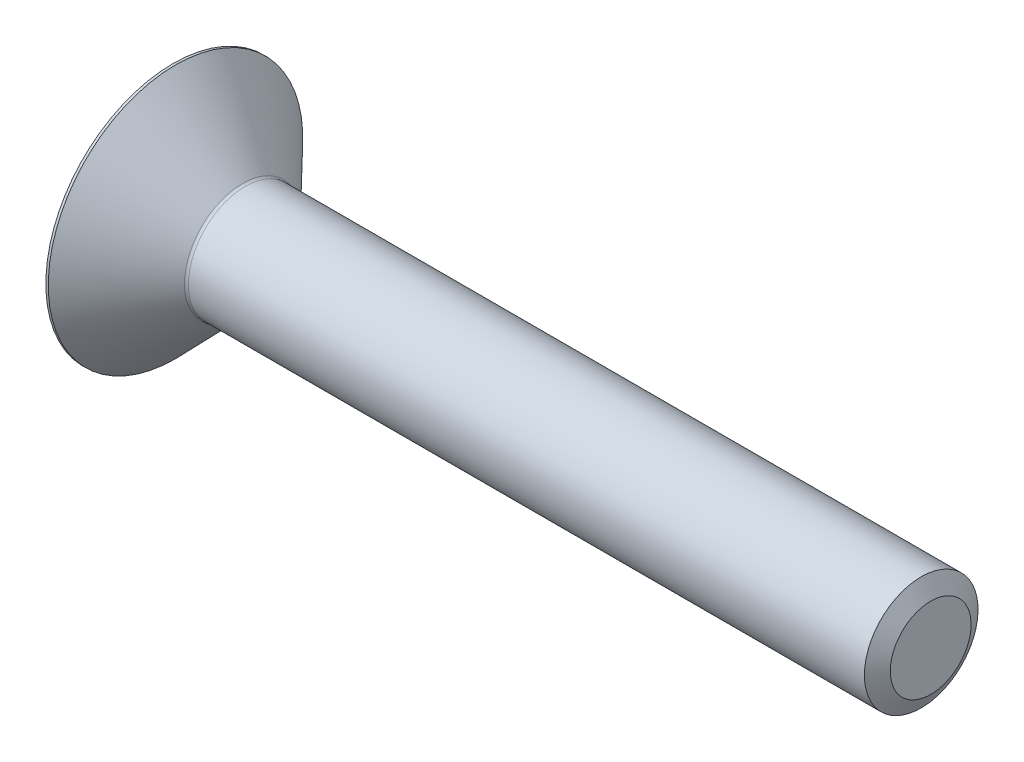
ISO-10303-21;
HEADER;
FILE_DESCRIPTION(('STEP AP214'),'2;1');
FILE_NAME('part.step','',(''),(''),'','','');
FILE_SCHEMA(('AUTOMOTIVE_DESIGN { 1 0 10303 214 1 1 1 1 }'));
ENDSEC;
DATA;
#1=APPLICATION_CONTEXT('core data for automotive mechanical design processes');
#2=APPLICATION_PROTOCOL_DEFINITION('international standard','automotive_design',2000,#1);
#3=PRODUCT_CONTEXT('',#1,'mechanical');
#4=PRODUCT('Part','Part','',(#3));
#5=PRODUCT_RELATED_PRODUCT_CATEGORY('part','',(#4));
#6=PRODUCT_DEFINITION_FORMATION('','',#4);
#7=PRODUCT_DEFINITION_CONTEXT('part definition',#1,'design');
#8=PRODUCT_DEFINITION('design','',#6,#7);
#9=PRODUCT_DEFINITION_SHAPE('','',#8);
#10=(LENGTH_UNIT() NAMED_UNIT(*) SI_UNIT(.MILLI.,.METRE.));
#11=(NAMED_UNIT(*) PLANE_ANGLE_UNIT() SI_UNIT($,.RADIAN.));
#12=(NAMED_UNIT(*) SI_UNIT($,.STERADIAN.) SOLID_ANGLE_UNIT());
#13=UNCERTAINTY_MEASURE_WITH_UNIT(LENGTH_MEASURE(1.E-05),#10,'distance_accuracy_value','');
#14=(GEOMETRIC_REPRESENTATION_CONTEXT(3) GLOBAL_UNCERTAINTY_ASSIGNED_CONTEXT((#13)) GLOBAL_UNIT_ASSIGNED_CONTEXT((#10,
#11,#12)) REPRESENTATION_CONTEXT('',''));
#15=CARTESIAN_POINT('',(0.,0.,0.));
#16=DIRECTION('',(0.,0.,1.));
#17=DIRECTION('',(1.,0.,0.));
#18=AXIS2_PLACEMENT_3D('',#15,#16,#17);
#19=CARTESIAN_POINT('',(0.,0.,0.));
#20=DIRECTION('',(1.,0.,0.));
#21=DIRECTION('',(0.,1.,0.));
#22=AXIS2_PLACEMENT_3D('',#19,#20,#21);
#23=CYLINDRICAL_SURFACE('',#22,1.5);
#24=CARTESIAN_POINT('',(-18.097552518379,0.,0.));
#25=DIRECTION('',(1.,0.,0.));
#26=DIRECTION('',(0.,1.,0.));
#27=AXIS2_PLACEMENT_3D('',#24,#25,#26);
#28=CIRCLE('',#27,1.5);
#29=CARTESIAN_POINT('',(-18.097552518379,1.5,0.));
#30=VERTEX_POINT('',#29);
#31=EDGE_CURVE('E133',#30,#30,#28,.T.);
#32=ORIENTED_EDGE('',*,*,#31,.T.);
#33=EDGE_LOOP('',(#32));
#34=FACE_BOUND('',#33,.T.);
#35=CARTESIAN_POINT('',(-0.25,0.,0.));
#36=DIRECTION('',(-1.,0.,0.));
#37=DIRECTION('',(0.,0.,1.));
#38=AXIS2_PLACEMENT_3D('',#35,#36,#37);
#39=CIRCLE('',#38,1.5);
#40=CARTESIAN_POINT('',(-0.25,0.,1.5));
#41=VERTEX_POINT('',#40);
#42=EDGE_CURVE('E321',#41,#41,#39,.T.);
#43=ORIENTED_EDGE('',*,*,#42,.T.);
#44=EDGE_LOOP('',(#43));
#45=FACE_BOUND('',#44,.T.);
#46=ADVANCED_FACE('F46',(#34,#45),#23,.T.);
#47=CARTESIAN_POINT('',(-20.,3.36,0.));
#48=DIRECTION('',(-1.,0.,0.));
#49=DIRECTION('',(0.,-1.,0.));
#50=AXIS2_PLACEMENT_3D('',#47,#48,#49);
#51=PLANE('',#50);
#52=CARTESIAN_POINT('',(-20.,0.,0.));
#53=DIRECTION('',(1.,0.,0.));
#54=DIRECTION('',(0.,1.,0.));
#55=AXIS2_PLACEMENT_3D('',#52,#53,#54);
#56=CIRCLE('',#55,3.36);
#57=CARTESIAN_POINT('',(-20.,3.36,0.));
#58=VERTEX_POINT('',#57);
#59=EDGE_CURVE('E224',#58,#58,#56,.T.);
#60=ORIENTED_EDGE('',*,*,#59,.F.);
#61=EDGE_LOOP('',(#60));
#62=FACE_BOUND('',#61,.T.);
#63=CARTESIAN_POINT('',(-20.,0.,0.));
#64=DIRECTION('',(-1.,0.,0.));
#65=DIRECTION('',(0.,-1.,0.));
#66=AXIS2_PLACEMENT_3D('',#63,#64,#65);
#67=CIRCLE('',#66,1.15470053837925);
#68=CARTESIAN_POINT('',(-20.,-0.577350269189632,0.999999999999995));
#69=VERTEX_POINT('',#68);
#70=CARTESIAN_POINT('',(-20.,-1.15470053837925,0.));
#71=VERTEX_POINT('',#70);
#72=EDGE_CURVE('E50',#69,#71,#67,.F.);
#73=ORIENTED_EDGE('',*,*,#72,.T.);
#74=CARTESIAN_POINT('',(-20.,-0.577350269189632,-0.999999999999996));
#75=VERTEX_POINT('',#74);
#76=EDGE_CURVE('E11',#71,#75,#67,.F.);
#77=ORIENTED_EDGE('',*,*,#76,.T.);
#78=CARTESIAN_POINT('',(-20.,0.577350269189625,-0.999999999999999));
#79=VERTEX_POINT('',#78);
#80=EDGE_CURVE('E55',#75,#79,#67,.F.);
#81=ORIENTED_EDGE('',*,*,#80,.T.);
#82=CARTESIAN_POINT('',(-20.,1.15470053837925,0.));
#83=VERTEX_POINT('',#82);
#84=EDGE_CURVE('E120',#79,#83,#67,.F.);
#85=ORIENTED_EDGE('',*,*,#84,.T.);
#86=CARTESIAN_POINT('',(-20.,0.,0.));
#87=DIRECTION('',(-1.,0.,0.));
#88=DIRECTION('',(0.,0.,1.));
#89=AXIS2_PLACEMENT_3D('',#86,#87,#88);
#90=CIRCLE('',#89,1.15470053837925);
#91=CARTESIAN_POINT('',(-20.,0.577350269189629,0.999999999999997));
#92=VERTEX_POINT('',#91);
#93=EDGE_CURVE('E105',#92,#83,#90,.T.);
#94=ORIENTED_EDGE('',*,*,#93,.F.);
#95=EDGE_CURVE('E114',#92,#69,#67,.F.);
#96=ORIENTED_EDGE('',*,*,#95,.T.);
#97=EDGE_LOOP('',(#73,#77,#81,#85,#94,#96));
#98=FACE_BOUND('',#97,.T.);
#99=ADVANCED_FACE('F121',(#62,#98),#51,.T.);
#100=CARTESIAN_POINT('',(0.,0.,0.));
#101=DIRECTION('',(1.,0.,0.));
#102=DIRECTION('',(0.,1.,0.));
#103=AXIS2_PLACEMENT_3D('',#100,#101,#102);
#104=CYLINDRICAL_SURFACE('',#103,3.36);
#105=ORIENTED_EDGE('',*,*,#59,.T.);
#106=EDGE_LOOP('',(#105));
#107=FACE_BOUND('',#106,.T.);
#108=CARTESIAN_POINT('',(-19.9361811211411,0.,0.));
#109=DIRECTION('',(1.,0.,0.));
#110=DIRECTION('',(0.,1.,0.));
#111=AXIS2_PLACEMENT_3D('',#108,#109,#110);
#112=CIRCLE('',#111,3.36);
#113=CARTESIAN_POINT('',(-19.9361811211411,3.36,0.));
#114=VERTEX_POINT('',#113);
#115=EDGE_CURVE('E226',#114,#114,#112,.T.);
#116=ORIENTED_EDGE('',*,*,#115,.F.);
#117=EDGE_LOOP('',(#116));
#118=FACE_BOUND('',#117,.T.);
#119=ADVANCED_FACE('F212',(#107,#118),#104,.T.);
#120=CARTESIAN_POINT('',(-18.1694864984129,0.,0.));
#121=DIRECTION('',(-1.,0.,0.));
#122=DIRECTION('',(0.,-1.,0.));
#123=AXIS2_PLACEMENT_3D('',#120,#121,#122);
#124=CONICAL_SURFACE('',#123,1.5305341629541,0.802851455917392);
#125=ORIENTED_EDGE('',*,*,#115,.T.);
#126=EDGE_LOOP('',(#125));
#127=FACE_BOUND('',#126,.T.);
#128=CARTESIAN_POINT('',(-18.1694864984129,0.,0.));
#129=DIRECTION('',(1.,0.,0.));
#130=DIRECTION('',(0.,1.,0.));
#131=AXIS2_PLACEMENT_3D('',#128,#129,#130);
#132=CIRCLE('',#131,1.5305341629541);
#133=CARTESIAN_POINT('',(-18.1694864984129,1.5305341629541,0.));
#134=VERTEX_POINT('',#133);
#135=EDGE_CURVE('E230',#134,#134,#132,.T.);
#136=ORIENTED_EDGE('',*,*,#135,.F.);
#137=EDGE_LOOP('',(#136));
#138=FACE_BOUND('',#137,.T.);
#139=ADVANCED_FACE('F208',(#127,#138),#124,.T.);
#140=CARTESIAN_POINT('',(-18.097552518379,0.,0.));
#141=DIRECTION('',(1.,0.,0.));
#142=DIRECTION('',(0.,1.,0.));
#143=AXIS2_PLACEMENT_3D('',#140,#141,#142);
#144=TOROIDAL_SURFACE('',#143,1.6,0.099999999999999);
#145=ORIENTED_EDGE('',*,*,#135,.T.);
#146=EDGE_LOOP('',(#145));
#147=FACE_BOUND('',#146,.T.);
#148=ORIENTED_EDGE('',*,*,#31,.F.);
#149=EDGE_LOOP('',(#148));
#150=FACE_BOUND('',#149,.T.);
#151=ADVANCED_FACE('F204',(#147,#150),#144,.F.);
#152=CARTESIAN_POINT('',(-19.7,0.,0.));
#153=DIRECTION('',(-1.,0.,0.));
#154=DIRECTION('',(0.,0.,1.));
#155=AXIS2_PLACEMENT_3D('',#152,#153,#154);
#156=CONICAL_SURFACE('',#155,0.,1.31660847419538);
#157=CARTESIAN_POINT('',(-20.0000300044996,-0.57723479913579,1.0002));
#158=CARTESIAN_POINT('',(-19.9937929192042,-0.601225021738601,0.958647715567044));
#159=CARTESIAN_POINT('',(-19.9881313786167,-0.625256195021442,0.917024502475671));
#160=CARTESIAN_POINT('',(-19.9781854217223,-0.673398386330441,0.833639781140785));
#161=CARTESIAN_POINT('',(-19.9739015302713,-0.697509431260086,0.791878226299064));
#162=CARTESIAN_POINT('',(-19.9669589031667,-0.745673772514857,0.708455140132714));
#163=CARTESIAN_POINT('',(-19.9642923745456,-0.769726780462719,0.66679410829216));
#164=CARTESIAN_POINT('',(-19.9607168929941,-0.817861664223351,0.583422044002323));
#165=CARTESIAN_POINT('',(-19.9598076211353,-0.841943534003896,0.541711022001162));
#166=CARTESIAN_POINT('',(-19.9598076211353,-0.890107273564986,0.458288977998839));
#167=CARTESIAN_POINT('',(-19.9607168929941,-0.91418914334553,0.416577955997678));
#168=CARTESIAN_POINT('',(-19.9642923745456,-0.962324027106162,0.333205891707841));
#169=CARTESIAN_POINT('',(-19.9669589031667,-0.986377035054024,0.291544859867286));
#170=CARTESIAN_POINT('',(-19.9739015302713,-1.0345413763088,0.208121773700937));
#171=CARTESIAN_POINT('',(-19.9781854217223,-1.05865242123844,0.166360218859216));
#172=CARTESIAN_POINT('',(-19.9881313786167,-1.10679461254744,0.0829754975243293));
#173=CARTESIAN_POINT('',(-19.9937929192042,-1.13082578583028,0.0413522844329566));
#174=CARTESIAN_POINT('',(-20.0000300044996,-1.15481600843309,-0.000199999999999027));
#175=B_SPLINE_CURVE_WITH_KNOTS('',3,(#157,#158,#159,#160,#161,#162,#163,#164,#165,#166,#167,
#168,#169,#170,#171,#172,#173,#174),.UNSPECIFIED.,.F.,.F.,(4,2,2,2,2,2,2,2,4),(0.,
0.145159524820137,0.290374287087484,0.434883682122849,0.57936684736763,0.723850012612411,
0.868359407647776,1.01357416991512,1.15873369473526),.UNSPECIFIED.);
#176=EDGE_CURVE('E139',#69,#71,#175,.T.);
#177=ORIENTED_EDGE('',*,*,#176,.T.);
#178=ORIENTED_EDGE('',*,*,#72,.F.);
#179=EDGE_LOOP('',(#177,#178));
#180=FACE_BOUND('',#179,.T.);
#181=ADVANCED_FACE('F207',(#180),#156,.F.);
#182=CARTESIAN_POINT('',(-20.1701338061757,-1.50813004503231,1.));
#183=CARTESIAN_POINT('',(-20.1603550434582,-1.4629616955144,1.));
#184=CARTESIAN_POINT('',(-20.1507010634319,-1.41776633015548,1.));
#185=CARTESIAN_POINT('',(-20.1317057249496,-1.32730802004726,1.));
#186=CARTESIAN_POINT('',(-20.1223643798043,-1.28204507250605,1.));
#187=CARTESIAN_POINT('',(-20.094887707109,-1.14605409321351,1.));
#188=CARTESIAN_POINT('',(-20.077318593487,-1.05520983554784,1.));
#189=CARTESIAN_POINT('',(-20.0446113120355,-0.873838301527075,1.));
#190=CARTESIAN_POINT('',(-20.0294545669183,-0.783314439111175,1.));
#191=CARTESIAN_POINT('',(-20.0026000869216,-0.601754544937862,1.));
#192=CARTESIAN_POINT('',(-19.9909016960468,-0.510718613654574,1.));
#193=CARTESIAN_POINT('',(-19.9724688104588,-0.327147289363391,1.));
#194=CARTESIAN_POINT('',(-19.965787761882,-0.234606191530869,1.));
#195=CARTESIAN_POINT('',(-19.9590368362792,-0.049304654603892,1.));
#196=CARTESIAN_POINT('',(-19.9589640024594,0.0434556678202334,1.));
#197=CARTESIAN_POINT('',(-19.9654534933963,0.229083736297408,1.));
#198=CARTESIAN_POINT('',(-19.9720414736928,0.321950510989412,1.));
#199=CARTESIAN_POINT('',(-19.9904572139866,0.507192547661323,1.));
#200=CARTESIAN_POINT('',(-20.0022884816114,0.599567438647768,1.));
#201=CARTESIAN_POINT('',(-20.0298118313046,0.785811374344477,1.));
#202=CARTESIAN_POINT('',(-20.0455836030667,0.879668210998828,1.));
#203=CARTESIAN_POINT('',(-20.0795232966728,1.06695285350417,1.));
#204=CARTESIAN_POINT('',(-20.0976915787193,1.16038059267178,1.));
#205=CARTESIAN_POINT('',(-20.1355853163011,1.34694314919726,1.));
#206=CARTESIAN_POINT('',(-20.1553112029702,1.44007787798179,1.));
#207=CARTESIAN_POINT('',(-20.1957971322914,1.62612272763755,1.));
#208=CARTESIAN_POINT('',(-20.216557196056,1.71903284388273,1.));
#209=CARTESIAN_POINT('',(-20.2585485742601,1.90363742744432,1.));
#210=CARTESIAN_POINT('',(-20.2797718689088,1.99533372655925,1.));
#211=CARTESIAN_POINT('',(-20.3227143057913,2.17861191601367,1.));
#212=CARTESIAN_POINT('',(-20.3444334585808,2.27019380387373,1.));
#213=CARTESIAN_POINT('',(-20.3882042420233,2.45314970796374,1.));
#214=CARTESIAN_POINT('',(-20.4102553943374,2.54452383886909,1.));
#215=CARTESIAN_POINT('',(-20.4546332471854,2.72720190599484,1.));
#216=CARTESIAN_POINT('',(-20.4769599382911,2.81850584450411,1.));
#217=CARTESIAN_POINT('',(-20.4993826695211,2.90978592143881,1.));
#218=B_SPLINE_CURVE_WITH_KNOTS('',3,(#182,#183,#184,#185,#186,#187,#188,#189,#190,#191,#192,
#193,#194,#195,#196,#197,#198,#199,#200,#201,#202,#203,#204,#205,#206,#207,#208,#209,#210,#211,
#212,#213,#214,#215,#216,#217),.UNSPECIFIED.,.F.,.F.,(4,2,2,2,2,2,2,2,2,2,2,2,2,2,2,2,2,4),(0.,
0.138643869889784,0.277293635233155,0.554857004517547,0.830167022781712,1.10542478551795,
1.38357462934899,1.66160001660697,1.94070037269333,2.21998772241581,2.50545939030147,
2.79097401441241,3.07656794584653,3.36216771000263,3.64452690710854,3.92689212062336,
4.2088834354874,4.49086512790399),.UNSPECIFIED.);
#219=EDGE_CURVE('E110',#92,#69,#218,.F.);
#220=ORIENTED_EDGE('',*,*,#219,.T.);
#221=ORIENTED_EDGE('',*,*,#95,.F.);
#222=EDGE_LOOP('',(#220,#221));
#223=FACE_BOUND('',#222,.T.);
#224=ADVANCED_FACE('F115',(#223),#156,.F.);
#225=CARTESIAN_POINT('',(-20.0000300044996,1.15481600843309,-0.000199999999999895));
#226=CARTESIAN_POINT('',(-19.9937929192042,1.13082578583028,0.0413522844329562));
#227=CARTESIAN_POINT('',(-19.9881313786167,1.10679461254744,0.082975497524329));
#228=CARTESIAN_POINT('',(-19.9781854217223,1.05865242123844,0.166360218859216));
#229=CARTESIAN_POINT('',(-19.9739015302713,1.03454137630879,0.208121773700936));
#230=CARTESIAN_POINT('',(-19.9669589031667,0.986377035054022,0.291544859867286));
#231=CARTESIAN_POINT('',(-19.9642923745456,0.96232402710616,0.33320589170784));
#232=CARTESIAN_POINT('',(-19.9607168929941,0.914189143345528,0.416577955997677));
#233=CARTESIAN_POINT('',(-19.9598076211353,0.890107273564983,0.458288977998838));
#234=CARTESIAN_POINT('',(-19.9598076211353,0.841943534003893,0.541711022001161));
#235=CARTESIAN_POINT('',(-19.9607168929941,0.817861664223348,0.583422044002323));
#236=CARTESIAN_POINT('',(-19.9642923745456,0.769726780462716,0.666794108292159));
#237=CARTESIAN_POINT('',(-19.9669589031667,0.745673772514854,0.708455140132714));
#238=CARTESIAN_POINT('',(-19.9739015302713,0.697509431260083,0.791878226299064));
#239=CARTESIAN_POINT('',(-19.9781854217223,0.673398386330438,0.833639781140784));
#240=CARTESIAN_POINT('',(-19.9881313786167,0.62525619502144,0.917024502475671));
#241=CARTESIAN_POINT('',(-19.9937929192042,0.601225021738599,0.958647715567044));
#242=CARTESIAN_POINT('',(-20.0000300044996,0.577234799135788,1.0002));
#243=B_SPLINE_CURVE_WITH_KNOTS('',3,(#225,#226,#227,#228,#229,#230,#231,#232,#233,#234,#235,
#236,#237,#238,#239,#240,#241,#242),.UNSPECIFIED.,.F.,.F.,(4,2,2,2,2,2,2,2,4),(0.,
0.145159524820138,0.290374287087485,0.43488368212285,0.579366847367631,0.723850012612412,
0.868359407647777,1.01357416991512,1.15873369473526),.UNSPECIFIED.);
#244=EDGE_CURVE('E101',#83,#92,#243,.T.);
#245=ORIENTED_EDGE('',*,*,#244,.T.);
#246=ORIENTED_EDGE('',*,*,#93,.T.);
#247=EDGE_LOOP('',(#245,#246));
#248=FACE_BOUND('',#247,.T.);
#249=ADVANCED_FACE('F103',(#248),#156,.F.);
#250=CARTESIAN_POINT('',(-20.0000300044996,0.577234799135787,-1.0002));
#251=CARTESIAN_POINT('',(-19.9937929192042,0.601225021738598,-0.958647715567043));
#252=CARTESIAN_POINT('',(-19.9881313786167,0.62525619502144,-0.91702450247567));
#253=CARTESIAN_POINT('',(-19.9781854217223,0.673398386330438,-0.833639781140784));
#254=CARTESIAN_POINT('',(-19.9739015302713,0.697509431260083,-0.791878226299063));
#255=CARTESIAN_POINT('',(-19.9669589031667,0.745673772514854,-0.708455140132714));
#256=CARTESIAN_POINT('',(-19.9642923745456,0.769726780462716,-0.666794108292159));
#257=CARTESIAN_POINT('',(-19.9607168929941,0.817861664223348,-0.583422044002322));
#258=CARTESIAN_POINT('',(-19.9598076211353,0.841943534003893,-0.541711022001161));
#259=CARTESIAN_POINT('',(-19.9598076211353,0.890107273564983,-0.458288977998838));
#260=CARTESIAN_POINT('',(-19.9607168929941,0.914189143345528,-0.416577955997677));
#261=CARTESIAN_POINT('',(-19.9642923745456,0.96232402710616,-0.33320589170784));
#262=CARTESIAN_POINT('',(-19.9669589031667,0.986377035054022,-0.291544859867286));
#263=CARTESIAN_POINT('',(-19.9739015302713,1.03454137630879,-0.208121773700936));
#264=CARTESIAN_POINT('',(-19.9781854217223,1.05865242123844,-0.166360218859216));
#265=CARTESIAN_POINT('',(-19.9881313786167,1.10679461254744,-0.082975497524329));
#266=CARTESIAN_POINT('',(-19.9937929192042,1.13082578583028,-0.0413522844329564));
#267=CARTESIAN_POINT('',(-20.0000300044996,1.15481600843309,0.00019999999999971));
#268=B_SPLINE_CURVE_WITH_KNOTS('',3,(#250,#251,#252,#253,#254,#255,#256,#257,#258,#259,#260,
#261,#262,#263,#264,#265,#266,#267),.UNSPECIFIED.,.F.,.F.,(4,2,2,2,2,2,2,2,4),(0.,
0.145159524820138,0.290374287087485,0.434883682122849,0.57936684736763,0.723850012612412,
0.868359407647776,1.01357416991512,1.15873369473526),.UNSPECIFIED.);
#269=EDGE_CURVE('E123',#79,#83,#268,.T.);
#270=ORIENTED_EDGE('',*,*,#269,.T.);
#271=ORIENTED_EDGE('',*,*,#84,.F.);
#272=EDGE_LOOP('',(#270,#271));
#273=FACE_BOUND('',#272,.T.);
#274=ADVANCED_FACE('F304',(#273),#156,.F.);
#275=CARTESIAN_POINT('',(-20.1701338061757,-1.50813004503231,-0.999999999999999));
#276=CARTESIAN_POINT('',(-20.1603550434582,-1.4629616955144,-0.999999999999999));
#277=CARTESIAN_POINT('',(-20.1507010634319,-1.41776633015548,-0.999999999999999));
#278=CARTESIAN_POINT('',(-20.1317057249496,-1.32730802004726,-0.999999999999999));
#279=CARTESIAN_POINT('',(-20.1223643798043,-1.28204507250605,-0.999999999999999));
#280=CARTESIAN_POINT('',(-20.094887707109,-1.14605409321351,-0.999999999999999));
#281=CARTESIAN_POINT('',(-20.077318593487,-1.05520983554784,-0.999999999999999));
#282=CARTESIAN_POINT('',(-20.0446113120355,-0.873838301527075,-0.999999999999999));
#283=CARTESIAN_POINT('',(-20.0294545669183,-0.783314439111175,-0.999999999999999));
#284=CARTESIAN_POINT('',(-20.0026000869216,-0.601754544937862,-0.999999999999999));
#285=CARTESIAN_POINT('',(-19.9909016960468,-0.510718613654574,-0.999999999999999));
#286=CARTESIAN_POINT('',(-19.9724688104588,-0.327147289363391,-0.999999999999999));
#287=CARTESIAN_POINT('',(-19.965787761882,-0.234606191530869,-0.999999999999999));
#288=CARTESIAN_POINT('',(-19.9590368362792,-0.0493046546038928,-0.999999999999999));
#289=CARTESIAN_POINT('',(-19.9589640024594,0.0434556678202325,-0.999999999999999));
#290=CARTESIAN_POINT('',(-19.9654534933963,0.229083736297407,-0.999999999999999));
#291=CARTESIAN_POINT('',(-19.9720414736928,0.321950510989411,-0.999999999999999));
#292=CARTESIAN_POINT('',(-19.9904572139866,0.507192547661322,-0.999999999999999));
#293=CARTESIAN_POINT('',(-20.0022884816114,0.599567438647767,-0.999999999999999));
#294=CARTESIAN_POINT('',(-20.0298118313046,0.785811374344477,-0.999999999999999));
#295=CARTESIAN_POINT('',(-20.0455836030667,0.879668210998828,-0.999999999999999));
#296=CARTESIAN_POINT('',(-20.0795232966728,1.06695285350417,-0.999999999999999));
#297=CARTESIAN_POINT('',(-20.0976915787193,1.16038059267178,-0.999999999999999));
#298=CARTESIAN_POINT('',(-20.1355853163011,1.34694314919726,-0.999999999999999));
#299=CARTESIAN_POINT('',(-20.1553112029702,1.44007787798179,-0.999999999999999));
#300=CARTESIAN_POINT('',(-20.1957971322914,1.62612272763755,-0.999999999999999));
#301=CARTESIAN_POINT('',(-20.216557196056,1.71903284388274,-0.999999999999999));
#302=CARTESIAN_POINT('',(-20.2585485742601,1.90363742744432,-0.999999999999999));
#303=CARTESIAN_POINT('',(-20.2797718689088,1.99533372655926,-0.999999999999999));
#304=CARTESIAN_POINT('',(-20.3227143057913,2.17861191601367,-0.999999999999999));
#305=CARTESIAN_POINT('',(-20.3444334585808,2.27019380387373,-0.999999999999999));
#306=CARTESIAN_POINT('',(-20.3882042420233,2.45314970796374,-0.999999999999999));
#307=CARTESIAN_POINT('',(-20.4102553943374,2.54452383886909,-0.999999999999999));
#308=CARTESIAN_POINT('',(-20.4546332471854,2.72720190599484,-0.999999999999999));
#309=CARTESIAN_POINT('',(-20.4769599382911,2.81850584450411,-0.999999999999999));
#310=CARTESIAN_POINT('',(-20.4993826695211,2.90978592143881,-0.999999999999999));
#311=B_SPLINE_CURVE_WITH_KNOTS('',3,(#275,#276,#277,#278,#279,#280,#281,#282,#283,#284,#285,
#286,#287,#288,#289,#290,#291,#292,#293,#294,#295,#296,#297,#298,#299,#300,#301,#302,#303,#304,
#305,#306,#307,#308,#309,#310),.UNSPECIFIED.,.F.,.F.,(4,2,2,2,2,2,2,2,2,2,2,2,2,2,2,2,2,4),(0.,
0.138643869889784,0.277293635233155,0.554857004517547,0.830167022781712,1.10542478551795,
1.38357462934899,1.66160001660697,1.94070037269333,2.21998772241581,2.50545939030147,
2.79097401441241,3.07656794584654,3.36216771000263,3.64452690710854,3.92689212062336,
4.2088834354874,4.49086512790399),.UNSPECIFIED.);
#312=EDGE_CURVE('E260',#75,#79,#311,.T.);
#313=ORIENTED_EDGE('',*,*,#312,.T.);
#314=ORIENTED_EDGE('',*,*,#80,.F.);
#315=EDGE_LOOP('',(#313,#314));
#316=FACE_BOUND('',#315,.T.);
#317=ADVANCED_FACE('F292',(#316),#156,.F.);
#318=CARTESIAN_POINT('',(-20.0000300044996,-1.15481600843309,0.000200000000000662));
#319=CARTESIAN_POINT('',(-19.9937929192042,-1.13082578583028,-0.0413522844329551));
#320=CARTESIAN_POINT('',(-19.9881313786167,-1.10679461254744,-0.0829754975243278));
#321=CARTESIAN_POINT('',(-19.9781854217223,-1.05865242123844,-0.166360218859215));
#322=CARTESIAN_POINT('',(-19.9739015302713,-1.0345413763088,-0.208121773700935));
#323=CARTESIAN_POINT('',(-19.9669589031667,-0.986377035054024,-0.291544859867285));
#324=CARTESIAN_POINT('',(-19.9642923745456,-0.962324027106163,-0.33320589170784));
#325=CARTESIAN_POINT('',(-19.9607168929941,-0.914189143345531,-0.416577955997676));
#326=CARTESIAN_POINT('',(-19.9598076211353,-0.890107273564986,-0.458288977998838));
#327=CARTESIAN_POINT('',(-19.9598076211353,-0.841943534003896,-0.541711022001161));
#328=CARTESIAN_POINT('',(-19.9607168929941,-0.817861664223351,-0.583422044002322));
#329=CARTESIAN_POINT('',(-19.9642923745456,-0.769726780462719,-0.666794108292158));
#330=CARTESIAN_POINT('',(-19.9669589031667,-0.745673772514857,-0.708455140132713));
#331=CARTESIAN_POINT('',(-19.9739015302713,-0.697509431260086,-0.791878226299063));
#332=CARTESIAN_POINT('',(-19.9781854217223,-0.673398386330441,-0.833639781140784));
#333=CARTESIAN_POINT('',(-19.9881313786167,-0.625256195021443,-0.917024502475671));
#334=CARTESIAN_POINT('',(-19.9937929192042,-0.601225021738601,-0.958647715567043));
#335=CARTESIAN_POINT('',(-20.0000300044996,-0.577234799135791,-1.0002));
#336=B_SPLINE_CURVE_WITH_KNOTS('',3,(#318,#319,#320,#321,#322,#323,#324,#325,#326,#327,#328,
#329,#330,#331,#332,#333,#334,#335),.UNSPECIFIED.,.F.,.F.,(4,2,2,2,2,2,2,2,4),(0.,
0.145159524820137,0.290374287087485,0.434883682122849,0.57936684736763,0.723850012612412,
0.868359407647776,1.01357416991512,1.15873369473526),.UNSPECIFIED.);
#337=EDGE_CURVE('E141',#71,#75,#336,.T.);
#338=ORIENTED_EDGE('',*,*,#337,.T.);
#339=ORIENTED_EDGE('',*,*,#76,.F.);
#340=EDGE_LOOP('',(#338,#339));
#341=FACE_BOUND('',#340,.T.);
#342=ADVANCED_FACE('F294',(#341),#156,.F.);
#343=CARTESIAN_POINT('',(-18.9,0.,0.));
#344=DIRECTION('',(-1.,0.,0.));
#345=DIRECTION('',(0.,0.,1.));
#346=AXIS2_PLACEMENT_3D('',#343,#344,#345);
#347=CONICAL_SURFACE('',#346,1.15470053837925,1.0471975511966);
#348=CARTESIAN_POINT('',(-18.2333333333333,0.,0.));
#349=VERTEX_POINT('',#348);
#350=VERTEX_LOOP('',#349);
#351=FACE_BOUND('',#350,.T.);
#352=CARTESIAN_POINT('',(-19.2718352887395,-1.49514512143374,1.));
#353=CARTESIAN_POINT('',(-19.2511150207934,-1.4519612611533,1.));
#354=CARTESIAN_POINT('',(-19.2306136723495,-1.40867282404236,1.));
#355=CARTESIAN_POINT('',(-19.1901634335246,-1.32182947914248,1.));
#356=CARTESIAN_POINT('',(-19.1702146425673,-1.27827452509756,1.));
#357=CARTESIAN_POINT('',(-19.1111451548365,-1.14662339890625,1.));
#358=CARTESIAN_POINT('',(-19.073052526533,-1.05805724149108,1.));
#359=CARTESIAN_POINT('',(-19.0002458207006,-0.876833003172497,1.));
#360=CARTESIAN_POINT('',(-18.9656458404539,-0.784128452056496,1.));
#361=CARTESIAN_POINT('',(-18.9040734738184,-0.596331746532132,1.));
#362=CARTESIAN_POINT('',(-18.8770812848479,-0.501246505541258,1.));
#363=CARTESIAN_POINT('',(-18.845775770035,-0.356699986452704,1.));
#364=CARTESIAN_POINT('',(-18.836875098547,-0.30824416317171,1.));
#365=CARTESIAN_POINT('',(-18.8227424317569,-0.210788870695443,1.));
#366=CARTESIAN_POINT('',(-18.8175101885352,-0.161789438465743,1.));
#367=CARTESIAN_POINT('',(-18.8111989809818,-0.0641060489970667,1.));
#368=CARTESIAN_POINT('',(-18.8100710050111,-0.0154253461269775,1.));
#369=CARTESIAN_POINT('',(-18.8119329783051,0.0818553564032749,1.));
#370=CARTESIAN_POINT('',(-18.8149231825536,0.130455350879702,1.));
#371=CARTESIAN_POINT('',(-18.8271183217293,0.250369589613778,1.));
#372=CARTESIAN_POINT('',(-18.8386085609849,0.321451919115026,1.));
#373=CARTESIAN_POINT('',(-18.8682403173976,0.462229038490167,1.));
#374=CARTESIAN_POINT('',(-18.8863898509449,0.531922048861732,1.));
#375=CARTESIAN_POINT('',(-18.9278697226866,0.671415729806804,1.));
#376=CARTESIAN_POINT('',(-18.9513071683069,0.741183729418068,1.));
#377=CARTESIAN_POINT('',(-19.0015644882464,0.879438319396286,1.));
#378=CARTESIAN_POINT('',(-19.0283831752305,0.947925349932559,1.));
#379=CARTESIAN_POINT('',(-19.1000539154734,1.12214515906644,1.));
#380=CARTESIAN_POINT('',(-19.146572305199,1.22718574040677,1.));
#381=CARTESIAN_POINT('',(-19.242876922248,1.43575968104557,1.));
#382=CARTESIAN_POINT('',(-19.2926639878222,1.53929264533347,1.));
#383=CARTESIAN_POINT('',(-19.3943364445346,1.74546702338821,1.));
#384=CARTESIAN_POINT('',(-19.446224181867,1.84810727553998,1.));
#385=CARTESIAN_POINT('',(-19.5513383688352,2.05270058021726,1.));
#386=CARTESIAN_POINT('',(-19.6045648626723,2.15465360991172,1.));
#387=CARTESIAN_POINT('',(-19.7068669169112,2.34846553091283,1.));
#388=CARTESIAN_POINT('',(-19.755859658964,2.4403682316157,1.));
#389=CARTESIAN_POINT('',(-19.8544031328282,2.623877990053,1.));
#390=CARTESIAN_POINT('',(-19.9039538852895,2.71548503668386,1.));
#391=CARTESIAN_POINT('',(-20.0033471076798,2.89823865557593,1.));
#392=CARTESIAN_POINT('',(-20.053188515041,2.98938580641155,1.));
#393=CARTESIAN_POINT('',(-20.1531957233761,3.17149583112621,1.));
#394=CARTESIAN_POINT('',(-20.2033615072371,3.26245871439935,1.));
#395=CARTESIAN_POINT('',(-20.253646212205,3.35335539208175,1.));
#396=B_SPLINE_CURVE_WITH_KNOTS('',3,(#352,#353,#354,#355,#356,#357,#358,#359,#360,#361,#362,
#363,#364,#365,#366,#367,#368,#369,#370,#371,#372,#373,#374,#375,#376,#377,#378,#379,#380,#381,
#382,#383,#384,#385,#386,#387,#388,#389,#390,#391,#392,#393,#394,#395),.UNSPECIFIED.,.F.,.F.,(4,
2,2,2,2,2,2,2,2,2,2,2,2,2,2,2,2,2,2,2,2,4),(0.,0.14369034182065,0.287406372566273,
0.576560332877491,0.87325948893403,1.16917907000006,1.31686338831957,1.46453772487642,
1.61044269221659,1.75635669390452,1.97192533331898,2.18775432802313,2.40842600301165,
2.62902040304935,2.97355048126458,3.31816926186283,3.6631841739513,4.00821049225241,
4.32064609598596,4.63309330006987,4.9447457824876,5.2563819552864),.UNSPECIFIED.);
#397=CARTESIAN_POINT('',(-18.9,-0.577350269189628,1.));
#398=VERTEX_POINT('',#397);
#399=CARTESIAN_POINT('',(-18.9,0.577350269189626,1.));
#400=VERTEX_POINT('',#399);
#401=EDGE_CURVE('E173',#398,#400,#396,.T.);
#402=ORIENTED_EDGE('',*,*,#401,.T.);
#403=CARTESIAN_POINT('',(-18.9000666766657,0.577234799135788,1.0002));
#404=CARTESIAN_POINT('',(-18.8854089736491,0.602607795820547,0.95625268060172));
#405=CARTESIAN_POINT('',(-18.8720777236209,0.628199807531657,0.911926016050179));
#406=CARTESIAN_POINT('',(-18.8488065076235,0.679827098330831,0.822504925328878));
#407=CARTESIAN_POINT('',(-18.8388747765498,0.705863295614158,0.777408908798268));
#408=CARTESIAN_POINT('',(-18.8234126948821,0.757612978088367,0.687775829477381));
#409=CARTESIAN_POINT('',(-18.817779468099,0.783318495222183,0.64325256776678));
#410=CARTESIAN_POINT('',(-18.8110512886403,0.834850648373671,0.553996260284982));
#411=CARTESIAN_POINT('',(-18.8099507679217,0.860677096749781,0.509263539518505));
#412=CARTESIAN_POINT('',(-18.8122250522981,0.908946264126689,0.425658889182653));
#413=CARTESIAN_POINT('',(-18.8150414388634,0.931396163287556,0.386774523211233));
#414=CARTESIAN_POINT('',(-18.8239724502174,0.976149681982092,0.309259155014813));
#415=CARTESIAN_POINT('',(-18.8300901337543,0.99845314641145,0.27062842143836));
#416=CARTESIAN_POINT('',(-18.8453857257258,1.04329913914046,0.192952883515855));
#417=CARTESIAN_POINT('',(-18.854628552169,1.0658359836813,0.153917923728832));
#418=CARTESIAN_POINT('',(-18.8756068457555,1.11057330008463,0.0764306187239878));
#419=CARTESIAN_POINT('',(-18.8873373751337,1.13277434629517,0.0379772787061406));
#420=CARTESIAN_POINT('',(-18.9000666766657,1.15481600843309,-0.000200000000000179));
#421=B_SPLINE_CURVE_WITH_KNOTS('',3,(#403,#404,#405,#406,#407,#408,#409,#410,#411,#412,#413,
#414,#415,#416,#417,#418,#419,#420),.UNSPECIFIED.,.F.,.F.,(4,2,2,2,2,2,2,2,4),(0.,
0.158523820030116,0.317428970089343,0.472400167924634,0.627180939971649,0.762016584872711,
0.896977373984233,1.03493410168667,1.17261952416172),.UNSPECIFIED.);
#422=CARTESIAN_POINT('',(-18.9,1.15470053837925,0.));
#423=VERTEX_POINT('',#422);
#424=EDGE_CURVE('E130',#400,#423,#421,.T.);
#425=ORIENTED_EDGE('',*,*,#424,.T.);
#426=CARTESIAN_POINT('',(-18.9000666766657,1.15481600843309,0.000200000000000381));
#427=CARTESIAN_POINT('',(-18.8854089736491,1.12944301174833,-0.0437473193982798));
#428=CARTESIAN_POINT('',(-18.8720777236209,1.10385100003722,-0.0880739839498201));
#429=CARTESIAN_POINT('',(-18.8488065076235,1.05222370923805,-0.177495074671122));
#430=CARTESIAN_POINT('',(-18.8388747765498,1.02618751195472,-0.222591091201731));
#431=CARTESIAN_POINT('',(-18.8234126948821,0.974437829480509,-0.312224170522618));
#432=CARTESIAN_POINT('',(-18.817779468099,0.948732312346694,-0.356747432233219));
#433=CARTESIAN_POINT('',(-18.8110512886403,0.897200159195206,-0.446003739715017));
#434=CARTESIAN_POINT('',(-18.8099507679217,0.871373710819096,-0.490736460481495));
#435=CARTESIAN_POINT('',(-18.8122250522981,0.823104543442187,-0.574341110817346));
#436=CARTESIAN_POINT('',(-18.8150414388634,0.80065464428132,-0.613225476788766));
#437=CARTESIAN_POINT('',(-18.8239724502174,0.755901125586784,-0.690740844985186));
#438=CARTESIAN_POINT('',(-18.8300901337543,0.733597661157426,-0.729371578561639));
#439=CARTESIAN_POINT('',(-18.8453857257258,0.688751668428419,-0.807047116484144));
#440=CARTESIAN_POINT('',(-18.854628552169,0.666214823887575,-0.846082076271167));
#441=CARTESIAN_POINT('',(-18.8756068457555,0.62147750748425,-0.923569381276011));
#442=CARTESIAN_POINT('',(-18.8873373751337,0.599276461273705,-0.962022721293858));
#443=CARTESIAN_POINT('',(-18.9000666766657,0.577234799135787,-1.0002));
#444=B_SPLINE_CURVE_WITH_KNOTS('',3,(#426,#427,#428,#429,#430,#431,#432,#433,#434,#435,#436,
#437,#438,#439,#440,#441,#442,#443),.UNSPECIFIED.,.F.,.F.,(4,2,2,2,2,2,2,2,4),(0.,
0.158523820030115,0.317428970089343,0.472400167924634,0.627180939971649,0.762016584872711,
0.896977373984233,1.03493410168667,1.17261952416172),.UNSPECIFIED.);
#445=CARTESIAN_POINT('',(-18.9,0.577350269189626,-0.999999999999999));
#446=VERTEX_POINT('',#445);
#447=EDGE_CURVE('E225',#423,#446,#444,.T.);
#448=ORIENTED_EDGE('',*,*,#447,.T.);
#449=CARTESIAN_POINT('',(-19.2718352887395,-1.49514512143374,-0.999999999999999));
#450=CARTESIAN_POINT('',(-19.2511150207934,-1.4519612611533,-0.999999999999999));
#451=CARTESIAN_POINT('',(-19.2306136723495,-1.40867282404236,-0.999999999999999));
#452=CARTESIAN_POINT('',(-19.1901634335246,-1.32182947914248,-0.999999999999999));
#453=CARTESIAN_POINT('',(-19.1702146425673,-1.27827452509756,-0.999999999999999));
#454=CARTESIAN_POINT('',(-19.1111451548365,-1.14662339890625,-0.999999999999999));
#455=CARTESIAN_POINT('',(-19.073052526533,-1.05805724149109,-0.999999999999999));
#456=CARTESIAN_POINT('',(-19.0002458207006,-0.876833003172498,-0.999999999999999));
#457=CARTESIAN_POINT('',(-18.9656458404539,-0.784128452056497,-0.999999999999999));
#458=CARTESIAN_POINT('',(-18.9040734738184,-0.596331746532132,-0.999999999999999));
#459=CARTESIAN_POINT('',(-18.8770812848479,-0.501246505541259,-0.999999999999999));
#460=CARTESIAN_POINT('',(-18.845775770035,-0.356699986452705,-0.999999999999999));
#461=CARTESIAN_POINT('',(-18.836875098547,-0.308244163171712,-0.999999999999999));
#462=CARTESIAN_POINT('',(-18.8227424317569,-0.210788870695445,-0.999999999999999));
#463=CARTESIAN_POINT('',(-18.8175101885352,-0.161789438465744,-0.999999999999999));
#464=CARTESIAN_POINT('',(-18.8111989809818,-0.0641060489970678,-0.999999999999999));
#465=CARTESIAN_POINT('',(-18.8100710050111,-0.0154253461269785,-0.999999999999999));
#466=CARTESIAN_POINT('',(-18.8119329783051,0.081855356403274,-0.999999999999999));
#467=CARTESIAN_POINT('',(-18.8149231825536,0.130455350879701,-0.999999999999999));
#468=CARTESIAN_POINT('',(-18.8271183217293,0.250369589613776,-0.999999999999999));
#469=CARTESIAN_POINT('',(-18.8386085609849,0.321451919115026,-0.999999999999999));
#470=CARTESIAN_POINT('',(-18.8682403173976,0.462229038490166,-0.999999999999999));
#471=CARTESIAN_POINT('',(-18.8863898509449,0.53192204886173,-0.999999999999999));
#472=CARTESIAN_POINT('',(-18.9278697226866,0.671415729806802,-0.999999999999999));
#473=CARTESIAN_POINT('',(-18.9513071683069,0.741183729418067,-0.999999999999999));
#474=CARTESIAN_POINT('',(-19.0015644882464,0.879438319396285,-0.999999999999999));
#475=CARTESIAN_POINT('',(-19.0283831752305,0.947925349932557,-0.999999999999999));
#476=CARTESIAN_POINT('',(-19.1000539154734,1.12214515906644,-0.999999999999999));
#477=CARTESIAN_POINT('',(-19.146572305199,1.22718574040677,-0.999999999999999));
#478=CARTESIAN_POINT('',(-19.242876922248,1.43575968104557,-0.999999999999999));
#479=CARTESIAN_POINT('',(-19.2926639878222,1.53929264533347,-0.999999999999999));
#480=CARTESIAN_POINT('',(-19.3943364445346,1.74546702338821,-0.999999999999999));
#481=CARTESIAN_POINT('',(-19.446224181867,1.84810727553998,-0.999999999999999));
#482=CARTESIAN_POINT('',(-19.5513383688352,2.05270058021726,-0.999999999999999));
#483=CARTESIAN_POINT('',(-19.6045648626723,2.15465360991172,-0.999999999999999));
#484=CARTESIAN_POINT('',(-19.7068669169112,2.34846553091283,-0.999999999999999));
#485=CARTESIAN_POINT('',(-19.755859658964,2.4403682316157,-0.999999999999999));
#486=CARTESIAN_POINT('',(-19.8544031328282,2.623877990053,-0.999999999999999));
#487=CARTESIAN_POINT('',(-19.9039538852895,2.71548503668386,-0.999999999999999));
#488=CARTESIAN_POINT('',(-20.0033471076798,2.89823865557593,-0.999999999999999));
#489=CARTESIAN_POINT('',(-20.053188515041,2.98938580641155,-0.999999999999999));
#490=CARTESIAN_POINT('',(-20.1531957233761,3.17149583112621,-0.999999999999999));
#491=CARTESIAN_POINT('',(-20.2033615072371,3.26245871439934,-0.999999999999999));
#492=CARTESIAN_POINT('',(-20.253646212205,3.35335539208175,-0.999999999999999));
#493=B_SPLINE_CURVE_WITH_KNOTS('',3,(#449,#450,#451,#452,#453,#454,#455,#456,#457,#458,#459,
#460,#461,#462,#463,#464,#465,#466,#467,#468,#469,#470,#471,#472,#473,#474,#475,#476,#477,#478,
#479,#480,#481,#482,#483,#484,#485,#486,#487,#488,#489,#490,#491,#492),.UNSPECIFIED.,.F.,.F.,(4,
2,2,2,2,2,2,2,2,2,2,2,2,2,2,2,2,2,2,2,2,4),(0.,0.14369034182065,0.287406372566273,
0.576560332877491,0.873259488934031,1.16917907000006,1.31686338831957,1.46453772487642,
1.61044269221659,1.75635669390452,1.97192533331898,2.18775432802313,2.40842600301165,
2.62902040304935,2.97355048126458,3.31816926186283,3.6631841739513,4.00821049225242,
4.32064609598596,4.63309330006987,4.9447457824876,5.2563819552864),.UNSPECIFIED.);
#494=CARTESIAN_POINT('',(-18.9,-0.577350269189628,-0.999999999999999));
#495=VERTEX_POINT('',#494);
#496=EDGE_CURVE('E109',#446,#495,#493,.F.);
#497=ORIENTED_EDGE('',*,*,#496,.T.);
#498=CARTESIAN_POINT('',(-18.9000666766657,-0.57723479913579,-1.0002));
#499=CARTESIAN_POINT('',(-18.8854089736491,-0.60260779582055,-0.956252680601719));
#500=CARTESIAN_POINT('',(-18.8720777236209,-0.62819980753166,-0.911926016050179));
#501=CARTESIAN_POINT('',(-18.8488065076235,-0.679827098330833,-0.822504925328877));
#502=CARTESIAN_POINT('',(-18.8388747765498,-0.705863295614161,-0.777408908798267));
#503=CARTESIAN_POINT('',(-18.8234126948821,-0.75761297808837,-0.68777582947738));
#504=CARTESIAN_POINT('',(-18.817779468099,-0.783318495222185,-0.643252567766779));
#505=CARTESIAN_POINT('',(-18.8110512886403,-0.834850648373673,-0.553996260284981));
#506=CARTESIAN_POINT('',(-18.8099507679217,-0.860677096749783,-0.509263539518504));
#507=CARTESIAN_POINT('',(-18.8122250522981,-0.908946264126692,-0.425658889182652));
#508=CARTESIAN_POINT('',(-18.8150414388634,-0.931396163287559,-0.386774523211232));
#509=CARTESIAN_POINT('',(-18.8239724502174,-0.976149681982095,-0.309259155014812));
#510=CARTESIAN_POINT('',(-18.8300901337543,-0.998453146411453,-0.270628421438359));
#511=CARTESIAN_POINT('',(-18.8453857257258,-1.04329913914046,-0.192952883515853));
#512=CARTESIAN_POINT('',(-18.854628552169,-1.0658359836813,-0.15391792372883));
#513=CARTESIAN_POINT('',(-18.8756068457555,-1.11057330008463,-0.0764306187239859));
#514=CARTESIAN_POINT('',(-18.8873373751337,-1.13277434629517,-0.0379772787061392));
#515=CARTESIAN_POINT('',(-18.9000666766657,-1.15481600843309,0.00020000000000061));
#516=B_SPLINE_CURVE_WITH_KNOTS('',3,(#498,#499,#500,#501,#502,#503,#504,#505,#506,#507,#508,
#509,#510,#511,#512,#513,#514,#515),.UNSPECIFIED.,.F.,.F.,(4,2,2,2,2,2,2,2,4),(0.,
0.158523820030115,0.317428970089343,0.472400167924634,0.627180939971649,0.762016584872711,
0.896977373984233,1.03493410168667,1.17261952416172),.UNSPECIFIED.);
#517=CARTESIAN_POINT('',(-18.9,-1.15470053837925,0.));
#518=VERTEX_POINT('',#517);
#519=EDGE_CURVE('E277',#495,#518,#516,.T.);
#520=ORIENTED_EDGE('',*,*,#519,.T.);
#521=CARTESIAN_POINT('',(-18.9000666766657,-1.15481600843309,-0.000199999999999338));
#522=CARTESIAN_POINT('',(-18.8854089736491,-1.12944301174833,0.0437473193982806));
#523=CARTESIAN_POINT('',(-18.8720777236209,-1.10385100003722,0.0880739839498211));
#524=CARTESIAN_POINT('',(-18.8488065076235,-1.05222370923805,0.177495074671123));
#525=CARTESIAN_POINT('',(-18.8388747765498,-1.02618751195472,0.222591091201732));
#526=CARTESIAN_POINT('',(-18.8234126948821,-0.974437829480511,0.31222417052262));
#527=CARTESIAN_POINT('',(-18.817779468099,-0.948732312346696,0.35674743223322));
#528=CARTESIAN_POINT('',(-18.8110512886403,-0.897200159195208,0.446003739715018));
#529=CARTESIAN_POINT('',(-18.8099507679217,-0.871373710819098,0.490736460481496));
#530=CARTESIAN_POINT('',(-18.8122250522981,-0.823104543442189,0.574341110817348));
#531=CARTESIAN_POINT('',(-18.8150414388634,-0.800654644281322,0.613225476788767));
#532=CARTESIAN_POINT('',(-18.8239724502174,-0.755901125586786,0.690740844985187));
#533=CARTESIAN_POINT('',(-18.8300901337543,-0.733597661157428,0.72937157856164));
#534=CARTESIAN_POINT('',(-18.8453857257258,-0.688751668428421,0.807047116484146));
#535=CARTESIAN_POINT('',(-18.854628552169,-0.666214823887577,0.846082076271168));
#536=CARTESIAN_POINT('',(-18.8756068457555,-0.621477507484252,0.923569381276013));
#537=CARTESIAN_POINT('',(-18.8873373751337,-0.599276461273707,0.96202272129386));
#538=CARTESIAN_POINT('',(-18.9000666766657,-0.57723479913579,1.0002));
#539=B_SPLINE_CURVE_WITH_KNOTS('',3,(#521,#522,#523,#524,#525,#526,#527,#528,#529,#530,#531,
#532,#533,#534,#535,#536,#537,#538),.UNSPECIFIED.,.F.,.F.,(4,2,2,2,2,2,2,2,4),(0.,
0.158523820030116,0.317428970089343,0.472400167924634,0.627180939971649,0.762016584872711,
0.896977373984233,1.03493410168667,1.17261952416172),.UNSPECIFIED.);
#540=EDGE_CURVE('E180',#518,#398,#539,.T.);
#541=ORIENTED_EDGE('',*,*,#540,.T.);
#542=EDGE_LOOP('',(#402,#425,#448,#497,#520,#541));
#543=FACE_BOUND('',#542,.T.);
#544=ADVANCED_FACE('F167',(#351,#543),#347,.F.);
#545=CARTESIAN_POINT('',(-18.14,1.15470053837925,0.));
#546=DIRECTION('',(0.,0.866025403784439,-0.5));
#547=DIRECTION('',(0.,0.5,0.866025403784439));
#548=AXIS2_PLACEMENT_3D('',#545,#546,#547);
#549=PLANE('',#548);
#550=ORIENTED_EDGE('',*,*,#269,.F.);
#551=DIRECTION('',(-1.,0.,0.));
#552=VECTOR('',#551,1.);
#553=CARTESIAN_POINT('',(-18.14,0.577350269189626,-0.999999999999999));
#554=LINE('',#553,#552);
#555=EDGE_CURVE('E243',#446,#79,#554,.T.);
#556=ORIENTED_EDGE('',*,*,#555,.F.);
#557=ORIENTED_EDGE('',*,*,#447,.F.);
#558=DIRECTION('',(-1.,0.,0.));
#559=VECTOR('',#558,1.);
#560=CARTESIAN_POINT('',(-18.14,1.15470053837925,0.));
#561=LINE('',#560,#559);
#562=EDGE_CURVE('E190',#423,#83,#561,.T.);
#563=ORIENTED_EDGE('',*,*,#562,.T.);
#564=EDGE_LOOP('',(#550,#556,#557,#563));
#565=FACE_BOUND('',#564,.T.);
#566=ADVANCED_FACE('F197',(#565),#549,.F.);
#567=CARTESIAN_POINT('',(-18.14,0.577350269189626,-0.999999999999999));
#568=DIRECTION('',(0.,0.,-1.));
#569=DIRECTION('',(-1.,0.,0.));
#570=AXIS2_PLACEMENT_3D('',#567,#568,#569);
#571=PLANE('',#570);
#572=ORIENTED_EDGE('',*,*,#312,.F.);
#573=DIRECTION('',(-1.,0.,0.));
#574=VECTOR('',#573,1.);
#575=CARTESIAN_POINT('',(-18.14,-0.577350269189628,-0.999999999999999));
#576=LINE('',#575,#574);
#577=EDGE_CURVE('E246',#495,#75,#576,.T.);
#578=ORIENTED_EDGE('',*,*,#577,.F.);
#579=ORIENTED_EDGE('',*,*,#496,.F.);
#580=ORIENTED_EDGE('',*,*,#555,.T.);
#581=EDGE_LOOP('',(#572,#578,#579,#580));
#582=FACE_BOUND('',#581,.T.);
#583=ADVANCED_FACE('F274',(#582),#571,.F.);
#584=CARTESIAN_POINT('',(-18.14,-0.577350269189628,-0.999999999999999));
#585=DIRECTION('',(0.,-0.866025403784439,-0.5));
#586=DIRECTION('',(0.,0.5,-0.866025403784439));
#587=AXIS2_PLACEMENT_3D('',#584,#585,#586);
#588=PLANE('',#587);
#589=ORIENTED_EDGE('',*,*,#337,.F.);
#590=DIRECTION('',(-1.,0.,0.));
#591=VECTOR('',#590,1.);
#592=CARTESIAN_POINT('',(-18.14,-1.15470053837925,0.));
#593=LINE('',#592,#591);
#594=EDGE_CURVE('E249',#518,#71,#593,.T.);
#595=ORIENTED_EDGE('',*,*,#594,.F.);
#596=ORIENTED_EDGE('',*,*,#519,.F.);
#597=ORIENTED_EDGE('',*,*,#577,.T.);
#598=EDGE_LOOP('',(#589,#595,#596,#597));
#599=FACE_BOUND('',#598,.T.);
#600=ADVANCED_FACE('F257',(#599),#588,.F.);
#601=CARTESIAN_POINT('',(-18.14,-1.15470053837925,0.));
#602=DIRECTION('',(0.,-0.866025403784439,0.5));
#603=DIRECTION('',(0.,-0.5,-0.866025403784439));
#604=AXIS2_PLACEMENT_3D('',#601,#602,#603);
#605=PLANE('',#604);
#606=ORIENTED_EDGE('',*,*,#176,.F.);
#607=DIRECTION('',(-1.,0.,0.));
#608=VECTOR('',#607,1.);
#609=CARTESIAN_POINT('',(-18.14,-0.577350269189628,1.));
#610=LINE('',#609,#608);
#611=EDGE_CURVE('E134',#398,#69,#610,.T.);
#612=ORIENTED_EDGE('',*,*,#611,.F.);
#613=ORIENTED_EDGE('',*,*,#540,.F.);
#614=ORIENTED_EDGE('',*,*,#594,.T.);
#615=EDGE_LOOP('',(#606,#612,#613,#614));
#616=FACE_BOUND('',#615,.T.);
#617=ADVANCED_FACE('F166',(#616),#605,.F.);
#618=CARTESIAN_POINT('',(-18.14,-0.577350269189628,1.));
#619=DIRECTION('',(0.,0.,1.));
#620=DIRECTION('',(1.,0.,0.));
#621=AXIS2_PLACEMENT_3D('',#618,#619,#620);
#622=PLANE('',#621);
#623=ORIENTED_EDGE('',*,*,#219,.F.);
#624=DIRECTION('',(-1.,0.,0.));
#625=VECTOR('',#624,1.);
#626=CARTESIAN_POINT('',(-18.14,0.577350269189626,1.));
#627=LINE('',#626,#625);
#628=EDGE_CURVE('E127',#400,#92,#627,.T.);
#629=ORIENTED_EDGE('',*,*,#628,.F.);
#630=ORIENTED_EDGE('',*,*,#401,.F.);
#631=ORIENTED_EDGE('',*,*,#611,.T.);
#632=EDGE_LOOP('',(#623,#629,#630,#631));
#633=FACE_BOUND('',#632,.T.);
#634=ADVANCED_FACE('F136',(#633),#622,.F.);
#635=CARTESIAN_POINT('',(-18.14,0.577350269189626,1.));
#636=DIRECTION('',(0.,0.866025403784439,0.5));
#637=DIRECTION('',(0.,-0.5,0.866025403784439));
#638=AXIS2_PLACEMENT_3D('',#635,#636,#637);
#639=PLANE('',#638);
#640=ORIENTED_EDGE('',*,*,#244,.F.);
#641=ORIENTED_EDGE('',*,*,#562,.F.);
#642=ORIENTED_EDGE('',*,*,#424,.F.);
#643=ORIENTED_EDGE('',*,*,#628,.T.);
#644=EDGE_LOOP('',(#640,#641,#642,#643));
#645=FACE_BOUND('',#644,.T.);
#646=ADVANCED_FACE('F128',(#645),#639,.F.);
#647=CARTESIAN_POINT('',(-0.25,0.,0.));
#648=DIRECTION('',(-1.,0.,0.));
#649=DIRECTION('',(0.,0.,1.));
#650=AXIS2_PLACEMENT_3D('',#647,#648,#649);
#651=CONICAL_SURFACE('',#650,1.5,1.0471975511966);
#652=CARTESIAN_POINT('',(0.,0.,0.));
#653=DIRECTION('',(-1.,0.,0.));
#654=DIRECTION('',(0.,0.,1.));
#655=AXIS2_PLACEMENT_3D('',#652,#653,#654);
#656=CIRCLE('',#655,1.06698729810778);
#657=CARTESIAN_POINT('',(0.,0.,1.06698729810778));
#658=VERTEX_POINT('',#657);
#659=EDGE_CURVE('E124',#658,#658,#656,.T.);
#660=ORIENTED_EDGE('',*,*,#659,.T.);
#661=EDGE_LOOP('',(#660));
#662=FACE_BOUND('',#661,.T.);
#663=ORIENTED_EDGE('',*,*,#42,.F.);
#664=EDGE_LOOP('',(#663));
#665=FACE_BOUND('',#664,.T.);
#666=ADVANCED_FACE('F196',(#662,#665),#651,.T.);
#667=CARTESIAN_POINT('',(0.,0.,0.));
#668=DIRECTION('',(1.,0.,0.));
#669=DIRECTION('',(0.,1.,0.));
#670=AXIS2_PLACEMENT_3D('',#667,#668,#669);
#671=PLANE('',#670);
#672=ORIENTED_EDGE('',*,*,#659,.F.);
#673=EDGE_LOOP('',(#672));
#674=FACE_BOUND('',#673,.T.);
#675=ADVANCED_FACE('F48',(#674),#671,.T.);
#676=CLOSED_SHELL('',(#46,#99,#119,#139,#151,#181,#224,#249,#274,#317,#342,#544,#566,#583,#600,
#617,#634,#646,#666,#675));
#677=MANIFOLD_SOLID_BREP('B2',#676);
#678=ADVANCED_BREP_SHAPE_REPRESENTATION('',(#18,#677),#14);
#679=SHAPE_DEFINITION_REPRESENTATION(#9,#678);
ENDSEC;
END-ISO-10303-21;
